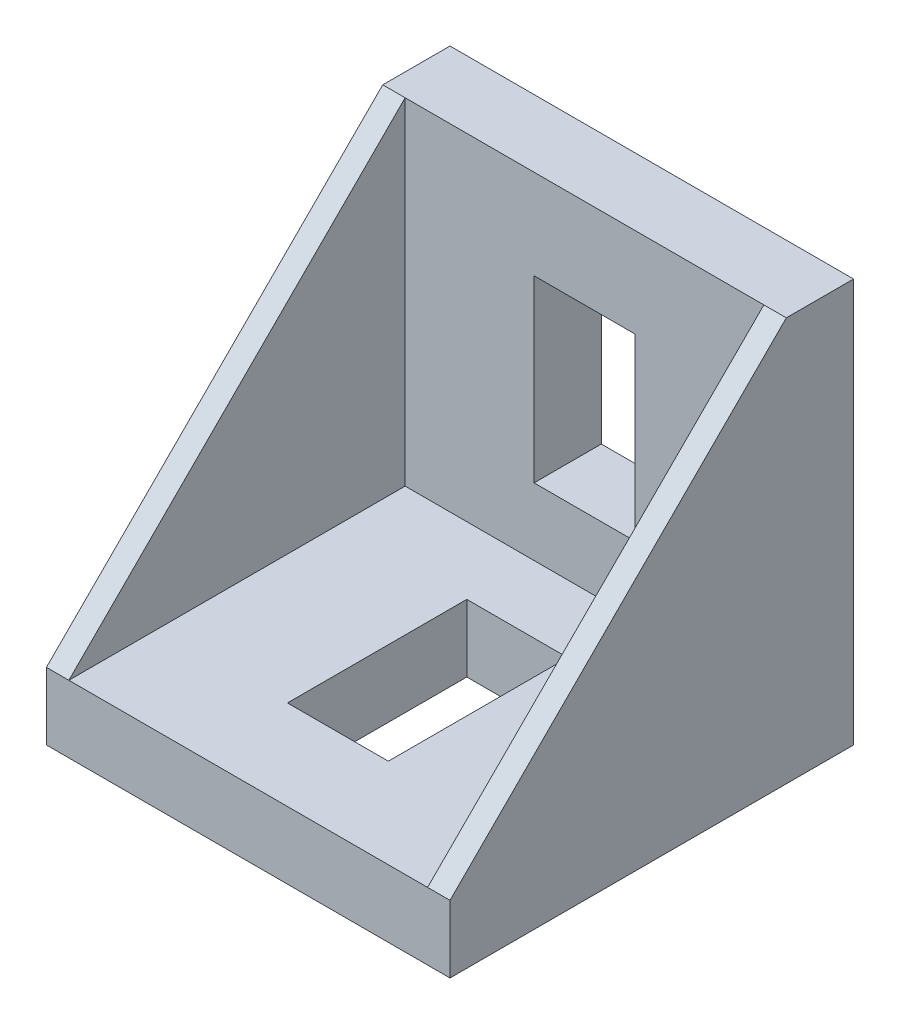
ISO-10303-21;
HEADER;
FILE_DESCRIPTION(('STEP AP214'),'2;1');
FILE_NAME('part.step','',(''),(''),'','','');
FILE_SCHEMA(('AUTOMOTIVE_DESIGN { 1 0 10303 214 1 1 1 1 }'));
ENDSEC;
DATA;
#1=APPLICATION_CONTEXT('core data for automotive mechanical design processes');
#2=APPLICATION_PROTOCOL_DEFINITION('international standard','automotive_design',2000,#1);
#3=PRODUCT_CONTEXT('',#1,'mechanical');
#4=PRODUCT('Part','Part','',(#3));
#5=PRODUCT_RELATED_PRODUCT_CATEGORY('part','',(#4));
#6=PRODUCT_DEFINITION_FORMATION('','',#4);
#7=PRODUCT_DEFINITION_CONTEXT('part definition',#1,'design');
#8=PRODUCT_DEFINITION('design','',#6,#7);
#9=PRODUCT_DEFINITION_SHAPE('','',#8);
#10=(LENGTH_UNIT() NAMED_UNIT(*) SI_UNIT(.MILLI.,.METRE.));
#11=(NAMED_UNIT(*) PLANE_ANGLE_UNIT() SI_UNIT($,.RADIAN.));
#12=(NAMED_UNIT(*) SI_UNIT($,.STERADIAN.) SOLID_ANGLE_UNIT());
#13=UNCERTAINTY_MEASURE_WITH_UNIT(LENGTH_MEASURE(1.E-05),#10,'distance_accuracy_value','');
#14=(GEOMETRIC_REPRESENTATION_CONTEXT(3) GLOBAL_UNCERTAINTY_ASSIGNED_CONTEXT((#13)) GLOBAL_UNIT_ASSIGNED_CONTEXT((#10,
#11,#12)) REPRESENTATION_CONTEXT('',''));
#15=CARTESIAN_POINT('',(0.,0.,0.));
#16=DIRECTION('',(0.,0.,1.));
#17=DIRECTION('',(1.,0.,0.));
#18=AXIS2_PLACEMENT_3D('',#15,#16,#17);
#19=CARTESIAN_POINT('',(0.,3.,0.));
#20=DIRECTION('',(0.,-1.,0.));
#21=DIRECTION('',(0.,0.,-1.));
#22=AXIS2_PLACEMENT_3D('',#19,#20,#21);
#23=PLANE('',#22);
#24=DIRECTION('',(1.,0.,0.));
#25=VECTOR('',#24,1.);
#26=CARTESIAN_POINT('',(-2.25,3.,5.));
#27=LINE('',#26,#25);
#28=CARTESIAN_POINT('',(-2.25,3.,5.));
#29=VERTEX_POINT('',#28);
#30=CARTESIAN_POINT('',(2.25,3.,5.));
#31=VERTEX_POINT('',#30);
#32=EDGE_CURVE('E166',#29,#31,#27,.T.);
#33=ORIENTED_EDGE('',*,*,#32,.F.);
#34=DIRECTION('',(0.,0.,1.));
#35=VECTOR('',#34,1.);
#36=CARTESIAN_POINT('',(-2.25,3.,5.));
#37=LINE('',#36,#35);
#38=CARTESIAN_POINT('',(-2.25,3.,-3.));
#39=VERTEX_POINT('',#38);
#40=EDGE_CURVE('E149',#39,#29,#37,.T.);
#41=ORIENTED_EDGE('',*,*,#40,.F.);
#42=DIRECTION('',(-1.,0.,0.));
#43=VECTOR('',#42,1.);
#44=CARTESIAN_POINT('',(-2.25,3.,-3.));
#45=LINE('',#44,#43);
#46=CARTESIAN_POINT('',(2.25,3.,-3.));
#47=VERTEX_POINT('',#46);
#48=EDGE_CURVE('E158',#47,#39,#45,.T.);
#49=ORIENTED_EDGE('',*,*,#48,.F.);
#50=DIRECTION('',(0.,0.,-1.));
#51=VECTOR('',#50,1.);
#52=CARTESIAN_POINT('',(2.25,3.,5.));
#53=LINE('',#52,#51);
#54=EDGE_CURVE('E49',#31,#47,#53,.T.);
#55=ORIENTED_EDGE('',*,*,#54,.F.);
#56=EDGE_LOOP('',(#33,#41,#49,#55));
#57=FACE_BOUND('',#56,.T.);
#58=DIRECTION('',(1.,0.,0.));
#59=VECTOR('',#58,1.);
#60=CARTESIAN_POINT('',(-9.,3.,9.));
#61=LINE('',#60,#59);
#62=CARTESIAN_POINT('',(-8.,3.,9.));
#63=VERTEX_POINT('',#62);
#64=CARTESIAN_POINT('',(8.,3.,9.));
#65=VERTEX_POINT('',#64);
#66=EDGE_CURVE('E249',#63,#65,#61,.T.);
#67=ORIENTED_EDGE('',*,*,#66,.T.);
#68=DIRECTION('',(0.,0.,-1.));
#69=VECTOR('',#68,1.);
#70=CARTESIAN_POINT('',(8.,3.,9.));
#71=LINE('',#70,#69);
#72=CARTESIAN_POINT('',(8.,3.,-6.));
#73=VERTEX_POINT('',#72);
#74=EDGE_CURVE('E183',#65,#73,#71,.T.);
#75=ORIENTED_EDGE('',*,*,#74,.T.);
#76=DIRECTION('',(1.,0.,0.));
#77=VECTOR('',#76,1.);
#78=CARTESIAN_POINT('',(-9.,3.,-6.));
#79=LINE('',#78,#77);
#80=CARTESIAN_POINT('',(-8.,3.,-6.));
#81=VERTEX_POINT('',#80);
#82=EDGE_CURVE('E222',#81,#73,#79,.T.);
#83=ORIENTED_EDGE('',*,*,#82,.F.);
#84=DIRECTION('',(0.,0.,-1.));
#85=VECTOR('',#84,1.);
#86=CARTESIAN_POINT('',(-8.,3.,9.));
#87=LINE('',#86,#85);
#88=EDGE_CURVE('E200',#63,#81,#87,.T.);
#89=ORIENTED_EDGE('',*,*,#88,.F.);
#90=EDGE_LOOP('',(#67,#75,#83,#89));
#91=FACE_BOUND('',#90,.T.);
#92=ADVANCED_FACE('F34',(#57,#91),#23,.F.);
#93=CARTESIAN_POINT('',(9.,3.,9.));
#94=DIRECTION('',(-1.,0.,0.));
#95=DIRECTION('',(0.,0.,1.));
#96=AXIS2_PLACEMENT_3D('',#93,#94,#95);
#97=PLANE('',#96);
#98=DIRECTION('',(0.,0.,-1.));
#99=VECTOR('',#98,1.);
#100=CARTESIAN_POINT('',(9.,0.,9.));
#101=LINE('',#100,#99);
#102=CARTESIAN_POINT('',(9.,0.,9.));
#103=VERTEX_POINT('',#102);
#104=CARTESIAN_POINT('',(9.,0.,-9.));
#105=VERTEX_POINT('',#104);
#106=EDGE_CURVE('E242',#103,#105,#101,.T.);
#107=ORIENTED_EDGE('',*,*,#106,.T.);
#108=DIRECTION('',(0.,-1.,0.));
#109=VECTOR('',#108,1.);
#110=CARTESIAN_POINT('',(9.,3.,-9.));
#111=LINE('',#110,#109);
#112=CARTESIAN_POINT('',(9.,18.,-9.));
#113=VERTEX_POINT('',#112);
#114=EDGE_CURVE('E266',#113,#105,#111,.T.);
#115=ORIENTED_EDGE('',*,*,#114,.F.);
#116=DIRECTION('',(0.,0.,1.));
#117=VECTOR('',#116,1.);
#118=CARTESIAN_POINT('',(9.,18.,-9.));
#119=LINE('',#118,#117);
#120=CARTESIAN_POINT('',(9.,18.,-6.));
#121=VERTEX_POINT('',#120);
#122=EDGE_CURVE('E232',#113,#121,#119,.T.);
#123=ORIENTED_EDGE('',*,*,#122,.T.);
#124=DIRECTION('',(0.,-0.707106781186547,0.707106781186547));
#125=VECTOR('',#124,1.);
#126=CARTESIAN_POINT('',(9.,18.,-6.));
#127=LINE('',#126,#125);
#128=CARTESIAN_POINT('',(9.,3.,9.));
#129=VERTEX_POINT('',#128);
#130=EDGE_CURVE('E161',#121,#129,#127,.T.);
#131=ORIENTED_EDGE('',*,*,#130,.T.);
#132=DIRECTION('',(0.,-1.,0.));
#133=VECTOR('',#132,1.);
#134=CARTESIAN_POINT('',(9.,3.,9.));
#135=LINE('',#134,#133);
#136=EDGE_CURVE('E248',#129,#103,#135,.T.);
#137=ORIENTED_EDGE('',*,*,#136,.T.);
#138=EDGE_LOOP('',(#107,#115,#123,#131,#137));
#139=FACE_BOUND('',#138,.T.);
#140=ADVANCED_FACE('F36',(#139),#97,.F.);
#141=CARTESIAN_POINT('',(-9.,3.,-9.));
#142=DIRECTION('',(0.,0.,1.));
#143=DIRECTION('',(1.,0.,0.));
#144=AXIS2_PLACEMENT_3D('',#141,#142,#143);
#145=PLANE('',#144);
#146=DIRECTION('',(-1.,0.,0.));
#147=VECTOR('',#146,1.);
#148=CARTESIAN_POINT('',(-9.,0.,-9.));
#149=LINE('',#148,#147);
#150=CARTESIAN_POINT('',(-9.,0.,-9.));
#151=VERTEX_POINT('',#150);
#152=EDGE_CURVE('E252',#105,#151,#149,.T.);
#153=ORIENTED_EDGE('',*,*,#152,.T.);
#154=DIRECTION('',(0.,-1.,0.));
#155=VECTOR('',#154,1.);
#156=CARTESIAN_POINT('',(-9.,3.,-9.));
#157=LINE('',#156,#155);
#158=CARTESIAN_POINT('',(-9.,18.,-9.));
#159=VERTEX_POINT('',#158);
#160=EDGE_CURVE('E264',#159,#151,#157,.T.);
#161=ORIENTED_EDGE('',*,*,#160,.F.);
#162=DIRECTION('',(1.,0.,0.));
#163=VECTOR('',#162,1.);
#164=CARTESIAN_POINT('',(-9.,18.,-9.));
#165=LINE('',#164,#163);
#166=EDGE_CURVE('E236',#159,#113,#165,.T.);
#167=ORIENTED_EDGE('',*,*,#166,.T.);
#168=ORIENTED_EDGE('',*,*,#114,.T.);
#169=EDGE_LOOP('',(#153,#161,#167,#168));
#170=FACE_BOUND('',#169,.T.);
#171=DIRECTION('',(0.,-1.,0.));
#172=VECTOR('',#171,1.);
#173=CARTESIAN_POINT('',(-2.25,14.,-9.));
#174=LINE('',#173,#172);
#175=CARTESIAN_POINT('',(-2.25,14.,-9.));
#176=VERTEX_POINT('',#175);
#177=CARTESIAN_POINT('',(-2.25,6.,-9.));
#178=VERTEX_POINT('',#177);
#179=EDGE_CURVE('E210',#176,#178,#174,.T.);
#180=ORIENTED_EDGE('',*,*,#179,.T.);
#181=DIRECTION('',(-1.,0.,0.));
#182=VECTOR('',#181,1.);
#183=CARTESIAN_POINT('',(2.24999999999999,6.,-9.));
#184=LINE('',#183,#182);
#185=CARTESIAN_POINT('',(2.24999999999999,6.,-9.));
#186=VERTEX_POINT('',#185);
#187=EDGE_CURVE('E207',#186,#178,#184,.T.);
#188=ORIENTED_EDGE('',*,*,#187,.F.);
#189=DIRECTION('',(0.,-1.,0.));
#190=VECTOR('',#189,1.);
#191=CARTESIAN_POINT('',(2.25,14.,-9.));
#192=LINE('',#191,#190);
#193=CARTESIAN_POINT('',(2.25,14.,-9.));
#194=VERTEX_POINT('',#193);
#195=EDGE_CURVE('E216',#194,#186,#192,.T.);
#196=ORIENTED_EDGE('',*,*,#195,.F.);
#197=DIRECTION('',(-1.,0.,0.));
#198=VECTOR('',#197,1.);
#199=CARTESIAN_POINT('',(2.25,14.,-9.));
#200=LINE('',#199,#198);
#201=EDGE_CURVE('E213',#194,#176,#200,.T.);
#202=ORIENTED_EDGE('',*,*,#201,.T.);
#203=EDGE_LOOP('',(#180,#188,#196,#202));
#204=FACE_BOUND('',#203,.T.);
#205=ADVANCED_FACE('F289',(#170,#204),#145,.F.);
#206=CARTESIAN_POINT('',(-9.,3.,9.));
#207=DIRECTION('',(1.,0.,0.));
#208=DIRECTION('',(0.,0.,-1.));
#209=AXIS2_PLACEMENT_3D('',#206,#207,#208);
#210=PLANE('',#209);
#211=DIRECTION('',(0.,-1.,0.));
#212=VECTOR('',#211,1.);
#213=CARTESIAN_POINT('',(-9.,3.,9.));
#214=LINE('',#213,#212);
#215=CARTESIAN_POINT('',(-9.,3.,9.));
#216=VERTEX_POINT('',#215);
#217=CARTESIAN_POINT('',(-9.,0.,9.));
#218=VERTEX_POINT('',#217);
#219=EDGE_CURVE('E261',#216,#218,#214,.T.);
#220=ORIENTED_EDGE('',*,*,#219,.F.);
#221=DIRECTION('',(0.,-0.707106781186547,0.707106781186547));
#222=VECTOR('',#221,1.);
#223=CARTESIAN_POINT('',(-9.,18.,-6.));
#224=LINE('',#223,#222);
#225=CARTESIAN_POINT('',(-9.,18.,-6.));
#226=VERTEX_POINT('',#225);
#227=EDGE_CURVE('E199',#226,#216,#224,.T.);
#228=ORIENTED_EDGE('',*,*,#227,.F.);
#229=DIRECTION('',(0.,0.,1.));
#230=VECTOR('',#229,1.);
#231=CARTESIAN_POINT('',(-9.,18.,-9.));
#232=LINE('',#231,#230);
#233=EDGE_CURVE('E239',#159,#226,#232,.T.);
#234=ORIENTED_EDGE('',*,*,#233,.F.);
#235=ORIENTED_EDGE('',*,*,#160,.T.);
#236=DIRECTION('',(0.,0.,1.));
#237=VECTOR('',#236,1.);
#238=CARTESIAN_POINT('',(-9.,0.,9.));
#239=LINE('',#238,#237);
#240=EDGE_CURVE('E255',#151,#218,#239,.T.);
#241=ORIENTED_EDGE('',*,*,#240,.T.);
#242=EDGE_LOOP('',(#220,#228,#234,#235,#241));
#243=FACE_BOUND('',#242,.T.);
#244=ADVANCED_FACE('F323',(#243),#210,.F.);
#245=CARTESIAN_POINT('',(-9.,3.,9.));
#246=DIRECTION('',(0.,0.,-1.));
#247=DIRECTION('',(-1.,0.,0.));
#248=AXIS2_PLACEMENT_3D('',#245,#246,#247);
#249=PLANE('',#248);
#250=DIRECTION('',(1.,0.,0.));
#251=VECTOR('',#250,1.);
#252=CARTESIAN_POINT('',(-9.,0.,9.));
#253=LINE('',#252,#251);
#254=EDGE_CURVE('E257',#218,#103,#253,.T.);
#255=ORIENTED_EDGE('',*,*,#254,.T.);
#256=ORIENTED_EDGE('',*,*,#136,.F.);
#257=DIRECTION('',(1.,0.,0.));
#258=VECTOR('',#257,1.);
#259=CARTESIAN_POINT('',(8.,3.,9.));
#260=LINE('',#259,#258);
#261=EDGE_CURVE('E197',#65,#129,#260,.T.);
#262=ORIENTED_EDGE('',*,*,#261,.F.);
#263=ORIENTED_EDGE('',*,*,#66,.F.);
#264=EDGE_CURVE('E245',#216,#63,#61,.T.);
#265=ORIENTED_EDGE('',*,*,#264,.F.);
#266=ORIENTED_EDGE('',*,*,#219,.T.);
#267=EDGE_LOOP('',(#255,#256,#262,#263,#265,#266));
#268=FACE_BOUND('',#267,.T.);
#269=ADVANCED_FACE('F319',(#268),#249,.F.);
#270=CARTESIAN_POINT('',(0.,0.,0.));
#271=DIRECTION('',(0.,-1.,0.));
#272=DIRECTION('',(0.,0.,-1.));
#273=AXIS2_PLACEMENT_3D('',#270,#271,#272);
#274=PLANE('',#273);
#275=DIRECTION('',(0.,0.,-1.));
#276=VECTOR('',#275,1.);
#277=CARTESIAN_POINT('',(-2.25,0.,5.));
#278=LINE('',#277,#276);
#279=CARTESIAN_POINT('',(-2.25,0.,5.));
#280=VERTEX_POINT('',#279);
#281=CARTESIAN_POINT('',(-2.25,0.,-3.));
#282=VERTEX_POINT('',#281);
#283=EDGE_CURVE('E57',#280,#282,#278,.T.);
#284=ORIENTED_EDGE('',*,*,#283,.F.);
#285=DIRECTION('',(-1.,0.,0.));
#286=VECTOR('',#285,1.);
#287=CARTESIAN_POINT('',(-2.25,0.,5.));
#288=LINE('',#287,#286);
#289=CARTESIAN_POINT('',(2.25,0.,5.));
#290=VERTEX_POINT('',#289);
#291=EDGE_CURVE('E155',#290,#280,#288,.T.);
#292=ORIENTED_EDGE('',*,*,#291,.F.);
#293=DIRECTION('',(0.,0.,1.));
#294=VECTOR('',#293,1.);
#295=CARTESIAN_POINT('',(2.25,0.,5.));
#296=LINE('',#295,#294);
#297=CARTESIAN_POINT('',(2.25,0.,-3.));
#298=VERTEX_POINT('',#297);
#299=EDGE_CURVE('E174',#298,#290,#296,.T.);
#300=ORIENTED_EDGE('',*,*,#299,.F.);
#301=DIRECTION('',(1.,0.,0.));
#302=VECTOR('',#301,1.);
#303=CARTESIAN_POINT('',(-2.25,0.,-3.));
#304=LINE('',#303,#302);
#305=EDGE_CURVE('E168',#282,#298,#304,.T.);
#306=ORIENTED_EDGE('',*,*,#305,.F.);
#307=EDGE_LOOP('',(#284,#292,#300,#306));
#308=FACE_BOUND('',#307,.T.);
#309=ORIENTED_EDGE('',*,*,#106,.F.);
#310=ORIENTED_EDGE('',*,*,#254,.F.);
#311=ORIENTED_EDGE('',*,*,#240,.F.);
#312=ORIENTED_EDGE('',*,*,#152,.F.);
#313=EDGE_LOOP('',(#309,#310,#311,#312));
#314=FACE_BOUND('',#313,.T.);
#315=ADVANCED_FACE('F316',(#308,#314),#274,.T.);
#316=CARTESIAN_POINT('',(-9.,18.,-6.));
#317=DIRECTION('',(0.,0.,-1.));
#318=DIRECTION('',(-1.,0.,0.));
#319=AXIS2_PLACEMENT_3D('',#316,#317,#318);
#320=PLANE('',#319);
#321=DIRECTION('',(0.,-1.,0.));
#322=VECTOR('',#321,1.);
#323=CARTESIAN_POINT('',(2.25,18.,-6.));
#324=LINE('',#323,#322);
#325=CARTESIAN_POINT('',(2.25,14.,-6.));
#326=VERTEX_POINT('',#325);
#327=CARTESIAN_POINT('',(2.24999999999999,6.,-6.));
#328=VERTEX_POINT('',#327);
#329=EDGE_CURVE('E42',#326,#328,#324,.T.);
#330=ORIENTED_EDGE('',*,*,#329,.T.);
#331=DIRECTION('',(-1.,0.,0.));
#332=VECTOR('',#331,1.);
#333=CARTESIAN_POINT('',(-9.00000000000001,6.,-6.));
#334=LINE('',#333,#332);
#335=CARTESIAN_POINT('',(-2.25,6.,-6.));
#336=VERTEX_POINT('',#335);
#337=EDGE_CURVE('E11',#328,#336,#334,.T.);
#338=ORIENTED_EDGE('',*,*,#337,.T.);
#339=DIRECTION('',(0.,-1.,0.));
#340=VECTOR('',#339,1.);
#341=CARTESIAN_POINT('',(-2.25,18.,-6.));
#342=LINE('',#341,#340);
#343=CARTESIAN_POINT('',(-2.25,14.,-6.));
#344=VERTEX_POINT('',#343);
#345=EDGE_CURVE('E268',#344,#336,#342,.T.);
#346=ORIENTED_EDGE('',*,*,#345,.F.);
#347=DIRECTION('',(-1.,0.,0.));
#348=VECTOR('',#347,1.);
#349=CARTESIAN_POINT('',(-9.,14.,-6.));
#350=LINE('',#349,#348);
#351=EDGE_CURVE('E270',#326,#344,#350,.T.);
#352=ORIENTED_EDGE('',*,*,#351,.F.);
#353=EDGE_LOOP('',(#330,#338,#346,#352));
#354=FACE_BOUND('',#353,.T.);
#355=ORIENTED_EDGE('',*,*,#82,.T.);
#356=DIRECTION('',(0.,1.,0.));
#357=VECTOR('',#356,1.);
#358=CARTESIAN_POINT('',(8.,3.,-6.));
#359=LINE('',#358,#357);
#360=CARTESIAN_POINT('',(8.,18.,-6.));
#361=VERTEX_POINT('',#360);
#362=EDGE_CURVE('E189',#73,#361,#359,.T.);
#363=ORIENTED_EDGE('',*,*,#362,.T.);
#364=DIRECTION('',(1.,0.,0.));
#365=VECTOR('',#364,1.);
#366=CARTESIAN_POINT('',(-9.,18.,-6.));
#367=LINE('',#366,#365);
#368=CARTESIAN_POINT('',(-8.,18.,-6.));
#369=VERTEX_POINT('',#368);
#370=EDGE_CURVE('E233',#369,#361,#367,.T.);
#371=ORIENTED_EDGE('',*,*,#370,.F.);
#372=DIRECTION('',(0.,1.,0.));
#373=VECTOR('',#372,1.);
#374=CARTESIAN_POINT('',(-8.,3.,-6.));
#375=LINE('',#374,#373);
#376=EDGE_CURVE('E202',#81,#369,#375,.T.);
#377=ORIENTED_EDGE('',*,*,#376,.F.);
#378=EDGE_LOOP('',(#355,#363,#371,#377));
#379=FACE_BOUND('',#378,.T.);
#380=ADVANCED_FACE('F275',(#354,#379),#320,.F.);
#381=CARTESIAN_POINT('',(0.,18.,0.));
#382=DIRECTION('',(0.,-1.,0.));
#383=DIRECTION('',(0.,0.,-1.));
#384=AXIS2_PLACEMENT_3D('',#381,#382,#383);
#385=PLANE('',#384);
#386=EDGE_CURVE('E229',#226,#369,#367,.T.);
#387=ORIENTED_EDGE('',*,*,#386,.T.);
#388=ORIENTED_EDGE('',*,*,#370,.T.);
#389=DIRECTION('',(1.,0.,0.));
#390=VECTOR('',#389,1.);
#391=CARTESIAN_POINT('',(8.,18.,-6.));
#392=LINE('',#391,#390);
#393=EDGE_CURVE('E192',#361,#121,#392,.T.);
#394=ORIENTED_EDGE('',*,*,#393,.T.);
#395=ORIENTED_EDGE('',*,*,#122,.F.);
#396=ORIENTED_EDGE('',*,*,#166,.F.);
#397=ORIENTED_EDGE('',*,*,#233,.T.);
#398=EDGE_LOOP('',(#387,#388,#394,#395,#396,#397));
#399=FACE_BOUND('',#398,.T.);
#400=ADVANCED_FACE('F351',(#399),#385,.F.);
#401=CARTESIAN_POINT('',(2.24999999999999,6.,9.));
#402=DIRECTION('',(0.,-1.,0.));
#403=DIRECTION('',(1.,0.,0.));
#404=AXIS2_PLACEMENT_3D('',#401,#402,#403);
#405=PLANE('',#404);
#406=DIRECTION('',(0.,0.,-1.));
#407=VECTOR('',#406,1.);
#408=CARTESIAN_POINT('',(2.24999999999999,6.,9.));
#409=LINE('',#408,#407);
#410=EDGE_CURVE('E220',#328,#186,#409,.T.);
#411=ORIENTED_EDGE('',*,*,#410,.T.);
#412=ORIENTED_EDGE('',*,*,#187,.T.);
#413=DIRECTION('',(0.,0.,-1.));
#414=VECTOR('',#413,1.);
#415=CARTESIAN_POINT('',(-2.25,6.,9.));
#416=LINE('',#415,#414);
#417=EDGE_CURVE('E219',#336,#178,#416,.T.);
#418=ORIENTED_EDGE('',*,*,#417,.F.);
#419=ORIENTED_EDGE('',*,*,#337,.F.);
#420=EDGE_LOOP('',(#411,#412,#418,#419));
#421=FACE_BOUND('',#420,.T.);
#422=ADVANCED_FACE('F292',(#421),#405,.F.);
#423=CARTESIAN_POINT('',(2.25,14.,9.));
#424=DIRECTION('',(1.,0.,0.));
#425=DIRECTION('',(0.,1.,0.));
#426=AXIS2_PLACEMENT_3D('',#423,#424,#425);
#427=PLANE('',#426);
#428=DIRECTION('',(0.,0.,-1.));
#429=VECTOR('',#428,1.);
#430=CARTESIAN_POINT('',(2.25,14.,9.));
#431=LINE('',#430,#429);
#432=EDGE_CURVE('E223',#326,#194,#431,.T.);
#433=ORIENTED_EDGE('',*,*,#432,.T.);
#434=ORIENTED_EDGE('',*,*,#195,.T.);
#435=ORIENTED_EDGE('',*,*,#410,.F.);
#436=ORIENTED_EDGE('',*,*,#329,.F.);
#437=EDGE_LOOP('',(#433,#434,#435,#436));
#438=FACE_BOUND('',#437,.T.);
#439=ADVANCED_FACE('F281',(#438),#427,.F.);
#440=CARTESIAN_POINT('',(2.25,14.,9.));
#441=DIRECTION('',(0.,-1.,0.));
#442=DIRECTION('',(1.,0.,0.));
#443=AXIS2_PLACEMENT_3D('',#440,#441,#442);
#444=PLANE('',#443);
#445=ORIENTED_EDGE('',*,*,#351,.T.);
#446=DIRECTION('',(0.,0.,-1.));
#447=VECTOR('',#446,1.);
#448=CARTESIAN_POINT('',(-2.25,14.,9.));
#449=LINE('',#448,#447);
#450=EDGE_CURVE('E225',#344,#176,#449,.T.);
#451=ORIENTED_EDGE('',*,*,#450,.T.);
#452=ORIENTED_EDGE('',*,*,#201,.F.);
#453=ORIENTED_EDGE('',*,*,#432,.F.);
#454=EDGE_LOOP('',(#445,#451,#452,#453));
#455=FACE_BOUND('',#454,.T.);
#456=ADVANCED_FACE('F284',(#455),#444,.T.);
#457=CARTESIAN_POINT('',(-2.25,14.,9.));
#458=DIRECTION('',(1.,0.,0.));
#459=DIRECTION('',(0.,1.,0.));
#460=AXIS2_PLACEMENT_3D('',#457,#458,#459);
#461=PLANE('',#460);
#462=ORIENTED_EDGE('',*,*,#345,.T.);
#463=ORIENTED_EDGE('',*,*,#417,.T.);
#464=ORIENTED_EDGE('',*,*,#179,.F.);
#465=ORIENTED_EDGE('',*,*,#450,.F.);
#466=EDGE_LOOP('',(#462,#463,#464,#465));
#467=FACE_BOUND('',#466,.T.);
#468=ADVANCED_FACE('F294',(#467),#461,.T.);
#469=CARTESIAN_POINT('',(-8.,18.,-6.));
#470=DIRECTION('',(0.,-0.707106781186547,-0.707106781186547));
#471=DIRECTION('',(0.,0.707106781186548,-0.707106781186548));
#472=AXIS2_PLACEMENT_3D('',#469,#470,#471);
#473=PLANE('',#472);
#474=ORIENTED_EDGE('',*,*,#227,.T.);
#475=ORIENTED_EDGE('',*,*,#264,.T.);
#476=DIRECTION('',(0.,-0.707106781186547,0.707106781186547));
#477=VECTOR('',#476,1.);
#478=CARTESIAN_POINT('',(-8.,18.,-6.));
#479=LINE('',#478,#477);
#480=EDGE_CURVE('E205',#369,#63,#479,.T.);
#481=ORIENTED_EDGE('',*,*,#480,.F.);
#482=ORIENTED_EDGE('',*,*,#386,.F.);
#483=EDGE_LOOP('',(#474,#475,#481,#482));
#484=FACE_BOUND('',#483,.T.);
#485=ADVANCED_FACE('F296',(#484),#473,.F.);
#486=CARTESIAN_POINT('',(-8.,0.,0.));
#487=DIRECTION('',(1.,0.,0.));
#488=DIRECTION('',(0.,0.,-1.));
#489=AXIS2_PLACEMENT_3D('',#486,#487,#488);
#490=PLANE('',#489);
#491=ORIENTED_EDGE('',*,*,#88,.T.);
#492=ORIENTED_EDGE('',*,*,#376,.T.);
#493=ORIENTED_EDGE('',*,*,#480,.T.);
#494=EDGE_LOOP('',(#491,#492,#493));
#495=FACE_BOUND('',#494,.T.);
#496=ADVANCED_FACE('F302',(#495),#490,.T.);
#497=CARTESIAN_POINT('',(8.,18.,-6.));
#498=DIRECTION('',(0.,0.707106781186547,0.707106781186547));
#499=DIRECTION('',(0.,-0.707106781186548,0.707106781186548));
#500=AXIS2_PLACEMENT_3D('',#497,#498,#499);
#501=PLANE('',#500);
#502=ORIENTED_EDGE('',*,*,#130,.F.);
#503=ORIENTED_EDGE('',*,*,#393,.F.);
#504=DIRECTION('',(0.,-0.707106781186547,0.707106781186547));
#505=VECTOR('',#504,1.);
#506=CARTESIAN_POINT('',(8.,18.,-6.));
#507=LINE('',#506,#505);
#508=EDGE_CURVE('E186',#361,#65,#507,.T.);
#509=ORIENTED_EDGE('',*,*,#508,.T.);
#510=ORIENTED_EDGE('',*,*,#261,.T.);
#511=EDGE_LOOP('',(#502,#503,#509,#510));
#512=FACE_BOUND('',#511,.T.);
#513=ADVANCED_FACE('F355',(#512),#501,.T.);
#514=CARTESIAN_POINT('',(8.,0.,0.));
#515=DIRECTION('',(-1.,0.,0.));
#516=DIRECTION('',(0.,0.,-1.));
#517=AXIS2_PLACEMENT_3D('',#514,#515,#516);
#518=PLANE('',#517);
#519=ORIENTED_EDGE('',*,*,#74,.F.);
#520=ORIENTED_EDGE('',*,*,#508,.F.);
#521=ORIENTED_EDGE('',*,*,#362,.F.);
#522=EDGE_LOOP('',(#519,#520,#521));
#523=FACE_BOUND('',#522,.T.);
#524=ADVANCED_FACE('F358',(#523),#518,.T.);
#525=CARTESIAN_POINT('',(-2.25,18.001,5.));
#526=DIRECTION('',(-1.,0.,0.));
#527=DIRECTION('',(0.,0.,1.));
#528=AXIS2_PLACEMENT_3D('',#525,#526,#527);
#529=PLANE('',#528);
#530=ORIENTED_EDGE('',*,*,#40,.T.);
#531=DIRECTION('',(0.,-1.,0.));
#532=VECTOR('',#531,1.);
#533=CARTESIAN_POINT('',(-2.25,18.001,5.));
#534=LINE('',#533,#532);
#535=EDGE_CURVE('E162',#29,#280,#534,.T.);
#536=ORIENTED_EDGE('',*,*,#535,.T.);
#537=ORIENTED_EDGE('',*,*,#283,.T.);
#538=DIRECTION('',(0.,-1.,0.));
#539=VECTOR('',#538,1.);
#540=CARTESIAN_POINT('',(-2.25,18.001,-3.));
#541=LINE('',#540,#539);
#542=EDGE_CURVE('E145',#39,#282,#541,.T.);
#543=ORIENTED_EDGE('',*,*,#542,.F.);
#544=EDGE_LOOP('',(#530,#536,#537,#543));
#545=FACE_BOUND('',#544,.T.);
#546=ADVANCED_FACE('F147',(#545),#529,.F.);
#547=CARTESIAN_POINT('',(-2.25,18.001,5.));
#548=DIRECTION('',(0.,0.,1.));
#549=DIRECTION('',(1.,0.,0.));
#550=AXIS2_PLACEMENT_3D('',#547,#548,#549);
#551=PLANE('',#550);
#552=ORIENTED_EDGE('',*,*,#32,.T.);
#553=DIRECTION('',(0.,-1.,0.));
#554=VECTOR('',#553,1.);
#555=CARTESIAN_POINT('',(2.25,18.001,5.));
#556=LINE('',#555,#554);
#557=EDGE_CURVE('E180',#31,#290,#556,.T.);
#558=ORIENTED_EDGE('',*,*,#557,.T.);
#559=ORIENTED_EDGE('',*,*,#291,.T.);
#560=ORIENTED_EDGE('',*,*,#535,.F.);
#561=EDGE_LOOP('',(#552,#558,#559,#560));
#562=FACE_BOUND('',#561,.T.);
#563=ADVANCED_FACE('F365',(#562),#551,.F.);
#564=CARTESIAN_POINT('',(2.25,18.001,5.));
#565=DIRECTION('',(1.,0.,0.));
#566=DIRECTION('',(0.,0.,-1.));
#567=AXIS2_PLACEMENT_3D('',#564,#565,#566);
#568=PLANE('',#567);
#569=ORIENTED_EDGE('',*,*,#54,.T.);
#570=DIRECTION('',(0.,-1.,0.));
#571=VECTOR('',#570,1.);
#572=CARTESIAN_POINT('',(2.25,18.001,-3.));
#573=LINE('',#572,#571);
#574=EDGE_CURVE('E154',#47,#298,#573,.T.);
#575=ORIENTED_EDGE('',*,*,#574,.T.);
#576=ORIENTED_EDGE('',*,*,#299,.T.);
#577=ORIENTED_EDGE('',*,*,#557,.F.);
#578=EDGE_LOOP('',(#569,#575,#576,#577));
#579=FACE_BOUND('',#578,.T.);
#580=ADVANCED_FACE('F496',(#579),#568,.F.);
#581=CARTESIAN_POINT('',(-2.25,18.001,-3.));
#582=DIRECTION('',(0.,0.,-1.));
#583=DIRECTION('',(-1.,0.,0.));
#584=AXIS2_PLACEMENT_3D('',#581,#582,#583);
#585=PLANE('',#584);
#586=ORIENTED_EDGE('',*,*,#48,.T.);
#587=ORIENTED_EDGE('',*,*,#542,.T.);
#588=ORIENTED_EDGE('',*,*,#305,.T.);
#589=ORIENTED_EDGE('',*,*,#574,.F.);
#590=EDGE_LOOP('',(#586,#587,#588,#589));
#591=FACE_BOUND('',#590,.T.);
#592=ADVANCED_FACE('F159',(#591),#585,.F.);
#593=CLOSED_SHELL('',(#92,#140,#205,#244,#269,#315,#380,#400,#422,#439,#456,#468,#485,#496,#513,
#524,#546,#563,#580,#592));
#594=MANIFOLD_SOLID_BREP('B2',#593);
#595=ADVANCED_BREP_SHAPE_REPRESENTATION('',(#18,#594),#14);
#596=SHAPE_DEFINITION_REPRESENTATION(#9,#595);
ENDSEC;
END-ISO-10303-21;
